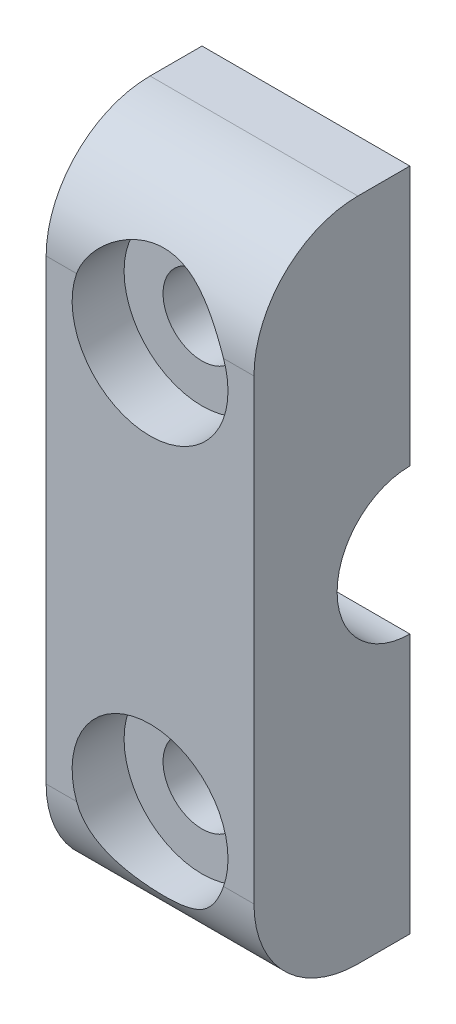
ISO-10303-21;
HEADER;
FILE_DESCRIPTION(('STEP AP214'),'2;1');
FILE_NAME('part.step','',(''),(''),'','','');
FILE_SCHEMA(('AUTOMOTIVE_DESIGN { 1 0 10303 214 1 1 1 1 }'));
ENDSEC;
DATA;
#1=APPLICATION_CONTEXT('core data for automotive mechanical design processes');
#2=APPLICATION_PROTOCOL_DEFINITION('international standard','automotive_design',2000,#1);
#3=PRODUCT_CONTEXT('',#1,'mechanical');
#4=PRODUCT('Part','Part','',(#3));
#5=PRODUCT_RELATED_PRODUCT_CATEGORY('part','',(#4));
#6=PRODUCT_DEFINITION_FORMATION('','',#4);
#7=PRODUCT_DEFINITION_CONTEXT('part definition',#1,'design');
#8=PRODUCT_DEFINITION('design','',#6,#7);
#9=PRODUCT_DEFINITION_SHAPE('','',#8);
#10=(LENGTH_UNIT() NAMED_UNIT(*) SI_UNIT(.MILLI.,.METRE.));
#11=(NAMED_UNIT(*) PLANE_ANGLE_UNIT() SI_UNIT($,.RADIAN.));
#12=(NAMED_UNIT(*) SI_UNIT($,.STERADIAN.) SOLID_ANGLE_UNIT());
#13=UNCERTAINTY_MEASURE_WITH_UNIT(LENGTH_MEASURE(1.E-05),#10,'distance_accuracy_value','');
#14=(GEOMETRIC_REPRESENTATION_CONTEXT(3) GLOBAL_UNCERTAINTY_ASSIGNED_CONTEXT((#13)) GLOBAL_UNIT_ASSIGNED_CONTEXT((#10,
#11,#12)) REPRESENTATION_CONTEXT('',''));
#15=CARTESIAN_POINT('',(0.,0.,0.));
#16=DIRECTION('',(0.,0.,1.));
#17=DIRECTION('',(1.,0.,0.));
#18=AXIS2_PLACEMENT_3D('',#15,#16,#17);
#19=CARTESIAN_POINT('',(0.,0.,0.));
#20=DIRECTION('',(0.,0.,1.));
#21=DIRECTION('',(1.,0.,0.));
#22=AXIS2_PLACEMENT_3D('',#19,#20,#21);
#23=PLANE('',#22);
#24=CARTESIAN_POINT('',(-128.440920983778,46.199185999186,0.));
#25=DIRECTION('',(0.,0.,1.));
#26=DIRECTION('',(1.,0.,0.));
#27=AXIS2_PLACEMENT_3D('',#24,#25,#26);
#28=CIRCLE('',#27,1.5);
#29=CARTESIAN_POINT('',(-126.940920983778,46.199185999186,0.));
#30=VERTEX_POINT('',#29);
#31=EDGE_CURVE('E246',#30,#30,#28,.T.);
#32=ORIENTED_EDGE('',*,*,#31,.T.);
#33=EDGE_LOOP('',(#32));
#34=FACE_BOUND('',#33,.T.);
#35=DIRECTION('',(0.,-1.,0.));
#36=VECTOR('',#35,1.);
#37=CARTESIAN_POINT('',(-132.440920983778,66.799185999186,0.));
#38=LINE('',#37,#36);
#39=CARTESIAN_POINT('',(-132.440920983778,51.199185999186,0.));
#40=VERTEX_POINT('',#39);
#41=CARTESIAN_POINT('',(-132.440920983778,41.199185999186,0.));
#42=VERTEX_POINT('',#41);
#43=EDGE_CURVE('E133',#40,#42,#38,.T.);
#44=ORIENTED_EDGE('',*,*,#43,.F.);
#45=DIRECTION('',(1.,0.,0.));
#46=VECTOR('',#45,1.);
#47=CARTESIAN_POINT('',(-132.440920983778,51.199185999186,0.));
#48=LINE('',#47,#46);
#49=CARTESIAN_POINT('',(-124.440920983778,51.199185999186,0.));
#50=VERTEX_POINT('',#49);
#51=EDGE_CURVE('E113',#40,#50,#48,.T.);
#52=ORIENTED_EDGE('',*,*,#51,.T.);
#53=DIRECTION('',(0.,1.,0.));
#54=VECTOR('',#53,1.);
#55=CARTESIAN_POINT('',(-124.440920983778,66.799185999186,0.));
#56=LINE('',#55,#54);
#57=CARTESIAN_POINT('',(-124.440920983778,41.199185999186,0.));
#58=VERTEX_POINT('',#57);
#59=EDGE_CURVE('E142',#58,#50,#56,.T.);
#60=ORIENTED_EDGE('',*,*,#59,.F.);
#61=DIRECTION('',(1.,0.,0.));
#62=VECTOR('',#61,1.);
#63=CARTESIAN_POINT('',(-132.440920983778,41.199185999186,0.));
#64=LINE('',#63,#62);
#65=EDGE_CURVE('E132',#42,#58,#64,.T.);
#66=ORIENTED_EDGE('',*,*,#65,.F.);
#67=EDGE_LOOP('',(#44,#52,#60,#66));
#68=FACE_BOUND('',#67,.T.);
#69=ADVANCED_FACE('F33',(#34,#68),#23,.F.);
#70=CARTESIAN_POINT('',(-128.440920983778,61.799185999186,6.));
#71=DIRECTION('',(0.,0.,-1.));
#72=DIRECTION('',(-1.,0.,0.));
#73=AXIS2_PLACEMENT_3D('',#70,#71,#72);
#74=CYLINDRICAL_SURFACE('',#73,1.5);
#75=CARTESIAN_POINT('',(-128.440920983778,61.799185999186,0.));
#76=DIRECTION('',(0.,0.,1.));
#77=DIRECTION('',(1.,0.,0.));
#78=AXIS2_PLACEMENT_3D('',#75,#76,#77);
#79=CIRCLE('',#78,1.5);
#80=CARTESIAN_POINT('',(-126.940920983778,61.799185999186,0.));
#81=VERTEX_POINT('',#80);
#82=EDGE_CURVE('E137',#81,#81,#79,.T.);
#83=ORIENTED_EDGE('',*,*,#82,.F.);
#84=EDGE_LOOP('',(#83));
#85=FACE_BOUND('',#84,.T.);
#86=CARTESIAN_POINT('',(-128.440920983778,61.799185999186,4.));
#87=DIRECTION('',(0.,0.,1.));
#88=DIRECTION('',(1.,0.,0.));
#89=AXIS2_PLACEMENT_3D('',#86,#87,#88);
#90=CIRCLE('',#89,1.5);
#91=CARTESIAN_POINT('',(-126.940920983778,61.799185999186,4.));
#92=VERTEX_POINT('',#91);
#93=EDGE_CURVE('E38',#92,#92,#90,.T.);
#94=ORIENTED_EDGE('',*,*,#93,.T.);
#95=EDGE_LOOP('',(#94));
#96=FACE_BOUND('',#95,.T.);
#97=ADVANCED_FACE('F208',(#85,#96),#74,.F.);
#98=CARTESIAN_POINT('',(-128.440920983778,46.199185999186,6.));
#99=DIRECTION('',(0.,0.,-1.));
#100=DIRECTION('',(-1.,0.,0.));
#101=AXIS2_PLACEMENT_3D('',#98,#99,#100);
#102=CYLINDRICAL_SURFACE('',#101,1.5);
#103=ORIENTED_EDGE('',*,*,#31,.F.);
#104=EDGE_LOOP('',(#103));
#105=FACE_BOUND('',#104,.T.);
#106=CARTESIAN_POINT('',(-128.440920983778,46.199185999186,4.));
#107=DIRECTION('',(0.,0.,1.));
#108=DIRECTION('',(1.,0.,0.));
#109=AXIS2_PLACEMENT_3D('',#106,#107,#108);
#110=CIRCLE('',#109,1.5);
#111=CARTESIAN_POINT('',(-126.940920983778,46.199185999186,4.));
#112=VERTEX_POINT('',#111);
#113=EDGE_CURVE('E276',#112,#112,#110,.T.);
#114=ORIENTED_EDGE('',*,*,#113,.T.);
#115=EDGE_LOOP('',(#114));
#116=FACE_BOUND('',#115,.T.);
#117=ADVANCED_FACE('F204',(#105,#116),#102,.F.);
#118=CARTESIAN_POINT('',(0.,0.,6.));
#119=DIRECTION('',(0.,0.,1.));
#120=DIRECTION('',(1.,0.,0.));
#121=AXIS2_PLACEMENT_3D('',#118,#119,#120);
#122=PLANE('',#121);
#123=CARTESIAN_POINT('',(-128.440920983778,46.199185999186,6.));
#124=DIRECTION('',(0.,0.,1.));
#125=DIRECTION('',(1.,0.,0.));
#126=AXIS2_PLACEMENT_3D('',#123,#124,#125);
#127=CIRCLE('',#126,2.99999999999999);
#128=CARTESIAN_POINT('',(-125.612493859032,45.199185999186,6.));
#129=VERTEX_POINT('',#128);
#130=CARTESIAN_POINT('',(-131.269348108524,45.199185999186,6.));
#131=VERTEX_POINT('',#130);
#132=EDGE_CURVE('E271',#129,#131,#127,.T.);
#133=ORIENTED_EDGE('',*,*,#132,.F.);
#134=DIRECTION('',(1.,0.,0.));
#135=VECTOR('',#134,1.);
#136=CARTESIAN_POINT('',(-124.440920983778,45.199185999186,6.));
#137=LINE('',#136,#135);
#138=CARTESIAN_POINT('',(-124.440920983778,45.199185999186,6.));
#139=VERTEX_POINT('',#138);
#140=EDGE_CURVE('E157',#129,#139,#137,.T.);
#141=ORIENTED_EDGE('',*,*,#140,.T.);
#142=DIRECTION('',(0.,1.,0.));
#143=VECTOR('',#142,1.);
#144=CARTESIAN_POINT('',(-124.440920983778,66.799185999186,6.));
#145=LINE('',#144,#143);
#146=CARTESIAN_POINT('',(-124.440920983778,62.799185999186,6.));
#147=VERTEX_POINT('',#146);
#148=EDGE_CURVE('E139',#139,#147,#145,.T.);
#149=ORIENTED_EDGE('',*,*,#148,.T.);
#150=DIRECTION('',(-1.,0.,0.));
#151=VECTOR('',#150,1.);
#152=CARTESIAN_POINT('',(-132.440920983778,62.799185999186,6.));
#153=LINE('',#152,#151);
#154=CARTESIAN_POINT('',(-125.612493859032,62.799185999186,6.));
#155=VERTEX_POINT('',#154);
#156=EDGE_CURVE('E164',#147,#155,#153,.T.);
#157=ORIENTED_EDGE('',*,*,#156,.T.);
#158=CARTESIAN_POINT('',(-128.440920983778,61.799185999186,6.));
#159=DIRECTION('',(0.,0.,1.));
#160=DIRECTION('',(1.,0.,0.));
#161=AXIS2_PLACEMENT_3D('',#158,#159,#160);
#162=CIRCLE('',#161,2.99999999999999);
#163=CARTESIAN_POINT('',(-131.269348108524,62.799185999186,6.));
#164=VERTEX_POINT('',#163);
#165=EDGE_CURVE('E57',#164,#155,#162,.T.);
#166=ORIENTED_EDGE('',*,*,#165,.F.);
#167=DIRECTION('',(-1.,0.,0.));
#168=VECTOR('',#167,1.);
#169=CARTESIAN_POINT('',(-132.440920983778,62.799185999186,6.));
#170=LINE('',#169,#168);
#171=CARTESIAN_POINT('',(-132.440920983778,62.799185999186,6.));
#172=VERTEX_POINT('',#171);
#173=EDGE_CURVE('E162',#164,#172,#170,.T.);
#174=ORIENTED_EDGE('',*,*,#173,.T.);
#175=DIRECTION('',(0.,-1.,0.));
#176=VECTOR('',#175,1.);
#177=CARTESIAN_POINT('',(-132.440920983778,66.799185999186,6.));
#178=LINE('',#177,#176);
#179=CARTESIAN_POINT('',(-132.440920983778,45.199185999186,6.));
#180=VERTEX_POINT('',#179);
#181=EDGE_CURVE('E147',#172,#180,#178,.T.);
#182=ORIENTED_EDGE('',*,*,#181,.T.);
#183=DIRECTION('',(1.,0.,0.));
#184=VECTOR('',#183,1.);
#185=CARTESIAN_POINT('',(-124.440920983778,45.199185999186,6.));
#186=LINE('',#185,#184);
#187=EDGE_CURVE('E159',#180,#131,#186,.T.);
#188=ORIENTED_EDGE('',*,*,#187,.T.);
#189=EDGE_LOOP('',(#133,#141,#149,#157,#166,#174,#182,#188));
#190=FACE_BOUND('',#189,.T.);
#191=ADVANCED_FACE('F207',(#190),#122,.T.);
#192=CARTESIAN_POINT('',(-124.440920983778,56.799185999186,0.));
#193=VERTEX_POINT('',#192);
#194=CARTESIAN_POINT('',(-124.440920983778,66.799185999186,0.));
#195=VERTEX_POINT('',#194);
#196=EDGE_CURVE('E126',#193,#195,#56,.T.);
#197=ORIENTED_EDGE('',*,*,#196,.F.);
#198=DIRECTION('',(1.,0.,0.));
#199=VECTOR('',#198,1.);
#200=CARTESIAN_POINT('',(-132.440920983778,56.799185999186,0.));
#201=LINE('',#200,#199);
#202=CARTESIAN_POINT('',(-132.440920983778,56.799185999186,0.));
#203=VERTEX_POINT('',#202);
#204=EDGE_CURVE('E51',#193,#203,#201,.F.);
#205=ORIENTED_EDGE('',*,*,#204,.T.);
#206=CARTESIAN_POINT('',(-132.440920983778,66.799185999186,0.));
#207=VERTEX_POINT('',#206);
#208=EDGE_CURVE('E125',#207,#203,#38,.T.);
#209=ORIENTED_EDGE('',*,*,#208,.F.);
#210=DIRECTION('',(-1.,0.,0.));
#211=VECTOR('',#210,1.);
#212=CARTESIAN_POINT('',(-132.440920983778,66.799185999186,0.));
#213=LINE('',#212,#211);
#214=EDGE_CURVE('E145',#195,#207,#213,.T.);
#215=ORIENTED_EDGE('',*,*,#214,.F.);
#216=EDGE_LOOP('',(#197,#205,#209,#215));
#217=FACE_BOUND('',#216,.T.);
#218=ORIENTED_EDGE('',*,*,#82,.T.);
#219=EDGE_LOOP('',(#218));
#220=FACE_BOUND('',#219,.T.);
#221=ADVANCED_FACE('F122',(#217,#220),#23,.F.);
#222=CARTESIAN_POINT('',(-132.440920983778,66.799185999186,6.));
#223=DIRECTION('',(1.,0.,0.));
#224=DIRECTION('',(0.,0.,-1.));
#225=AXIS2_PLACEMENT_3D('',#222,#223,#224);
#226=PLANE('',#225);
#227=ORIENTED_EDGE('',*,*,#208,.T.);
#228=CARTESIAN_POINT('',(-132.440920983778,53.999185999186,0.));
#229=DIRECTION('',(1.,0.,0.));
#230=DIRECTION('',(0.,0.,-1.));
#231=AXIS2_PLACEMENT_3D('',#228,#229,#230);
#232=CIRCLE('',#231,2.8);
#233=EDGE_CURVE('E110',#203,#40,#232,.T.);
#234=ORIENTED_EDGE('',*,*,#233,.T.);
#235=ORIENTED_EDGE('',*,*,#43,.T.);
#236=DIRECTION('',(0.,0.,-1.));
#237=VECTOR('',#236,1.);
#238=CARTESIAN_POINT('',(-132.440920983778,41.199185999186,6.));
#239=LINE('',#238,#237);
#240=CARTESIAN_POINT('',(-132.440920983778,41.199185999186,2.));
#241=VERTEX_POINT('',#240);
#242=EDGE_CURVE('E154',#241,#42,#239,.T.);
#243=ORIENTED_EDGE('',*,*,#242,.F.);
#244=CARTESIAN_POINT('',(-132.440920983778,45.199185999186,2.));
#245=DIRECTION('',(1.,0.,0.));
#246=DIRECTION('',(0.,0.,-1.));
#247=AXIS2_PLACEMENT_3D('',#244,#245,#246);
#248=CIRCLE('',#247,4.);
#249=EDGE_CURVE('E167',#241,#180,#248,.F.);
#250=ORIENTED_EDGE('',*,*,#249,.T.);
#251=ORIENTED_EDGE('',*,*,#181,.F.);
#252=CARTESIAN_POINT('',(-132.440920983778,62.799185999186,2.));
#253=DIRECTION('',(1.,0.,0.));
#254=DIRECTION('',(0.,0.,-1.));
#255=AXIS2_PLACEMENT_3D('',#252,#253,#254);
#256=CIRCLE('',#255,4.);
#257=CARTESIAN_POINT('',(-132.440920983778,66.799185999186,2.));
#258=VERTEX_POINT('',#257);
#259=EDGE_CURVE('E169',#172,#258,#256,.F.);
#260=ORIENTED_EDGE('',*,*,#259,.T.);
#261=DIRECTION('',(0.,0.,-1.));
#262=VECTOR('',#261,1.);
#263=CARTESIAN_POINT('',(-132.440920983778,66.799185999186,6.));
#264=LINE('',#263,#262);
#265=EDGE_CURVE('E130',#258,#207,#264,.T.);
#266=ORIENTED_EDGE('',*,*,#265,.T.);
#267=EDGE_LOOP('',(#227,#234,#235,#243,#250,#251,#260,#266));
#268=FACE_BOUND('',#267,.T.);
#269=ADVANCED_FACE('F128',(#268),#226,.F.);
#270=CARTESIAN_POINT('',(-132.440920983778,41.199185999186,6.));
#271=DIRECTION('',(0.,1.,0.));
#272=DIRECTION('',(0.,0.,1.));
#273=AXIS2_PLACEMENT_3D('',#270,#271,#272);
#274=PLANE('',#273);
#275=DIRECTION('',(0.,0.,-1.));
#276=VECTOR('',#275,1.);
#277=CARTESIAN_POINT('',(-124.440920983778,41.199185999186,6.));
#278=LINE('',#277,#276);
#279=CARTESIAN_POINT('',(-124.440920983778,41.199185999186,2.));
#280=VERTEX_POINT('',#279);
#281=EDGE_CURVE('E152',#280,#58,#278,.T.);
#282=ORIENTED_EDGE('',*,*,#281,.F.);
#283=DIRECTION('',(1.,0.,0.));
#284=VECTOR('',#283,1.);
#285=CARTESIAN_POINT('',(-132.440920983778,41.199185999186,2.));
#286=LINE('',#285,#284);
#287=EDGE_CURVE('E177',#280,#241,#286,.F.);
#288=ORIENTED_EDGE('',*,*,#287,.T.);
#289=ORIENTED_EDGE('',*,*,#242,.T.);
#290=ORIENTED_EDGE('',*,*,#65,.T.);
#291=EDGE_LOOP('',(#282,#288,#289,#290));
#292=FACE_BOUND('',#291,.T.);
#293=ADVANCED_FACE('F226',(#292),#274,.F.);
#294=CARTESIAN_POINT('',(-124.440920983778,66.799185999186,6.));
#295=DIRECTION('',(-1.,0.,0.));
#296=DIRECTION('',(0.,0.,1.));
#297=AXIS2_PLACEMENT_3D('',#294,#295,#296);
#298=PLANE('',#297);
#299=ORIENTED_EDGE('',*,*,#59,.T.);
#300=CARTESIAN_POINT('',(-124.440920983778,53.999185999186,0.));
#301=DIRECTION('',(1.,0.,0.));
#302=DIRECTION('',(0.,0.,-1.));
#303=AXIS2_PLACEMENT_3D('',#300,#301,#302);
#304=CIRCLE('',#303,2.8);
#305=EDGE_CURVE('E117',#193,#50,#304,.T.);
#306=ORIENTED_EDGE('',*,*,#305,.F.);
#307=ORIENTED_EDGE('',*,*,#196,.T.);
#308=DIRECTION('',(0.,0.,-1.));
#309=VECTOR('',#308,1.);
#310=CARTESIAN_POINT('',(-124.440920983778,66.799185999186,6.));
#311=LINE('',#310,#309);
#312=CARTESIAN_POINT('',(-124.440920983778,66.799185999186,2.));
#313=VERTEX_POINT('',#312);
#314=EDGE_CURVE('E149',#313,#195,#311,.T.);
#315=ORIENTED_EDGE('',*,*,#314,.F.);
#316=CARTESIAN_POINT('',(-124.440920983778,62.799185999186,2.));
#317=DIRECTION('',(-1.,0.,0.));
#318=DIRECTION('',(0.,0.,1.));
#319=AXIS2_PLACEMENT_3D('',#316,#317,#318);
#320=CIRCLE('',#319,4.);
#321=EDGE_CURVE('E175',#313,#147,#320,.F.);
#322=ORIENTED_EDGE('',*,*,#321,.T.);
#323=ORIENTED_EDGE('',*,*,#148,.F.);
#324=CARTESIAN_POINT('',(-124.440920983778,45.199185999186,2.));
#325=DIRECTION('',(-1.,0.,0.));
#326=DIRECTION('',(0.,0.,1.));
#327=AXIS2_PLACEMENT_3D('',#324,#325,#326);
#328=CIRCLE('',#327,4.);
#329=EDGE_CURVE('E173',#139,#280,#328,.F.);
#330=ORIENTED_EDGE('',*,*,#329,.T.);
#331=ORIENTED_EDGE('',*,*,#281,.T.);
#332=EDGE_LOOP('',(#299,#306,#307,#315,#322,#323,#330,#331));
#333=FACE_BOUND('',#332,.T.);
#334=ADVANCED_FACE('F222',(#333),#298,.F.);
#335=CARTESIAN_POINT('',(-132.440920983778,66.799185999186,6.));
#336=DIRECTION('',(0.,-1.,0.));
#337=DIRECTION('',(0.,0.,-1.));
#338=AXIS2_PLACEMENT_3D('',#335,#336,#337);
#339=PLANE('',#338);
#340=ORIENTED_EDGE('',*,*,#265,.F.);
#341=DIRECTION('',(-1.,0.,0.));
#342=VECTOR('',#341,1.);
#343=CARTESIAN_POINT('',(-124.440920983778,66.799185999186,2.));
#344=LINE('',#343,#342);
#345=EDGE_CURVE('E171',#258,#313,#344,.F.);
#346=ORIENTED_EDGE('',*,*,#345,.T.);
#347=ORIENTED_EDGE('',*,*,#314,.T.);
#348=ORIENTED_EDGE('',*,*,#214,.T.);
#349=EDGE_LOOP('',(#340,#346,#347,#348));
#350=FACE_BOUND('',#349,.T.);
#351=ADVANCED_FACE('F218',(#350),#339,.F.);
#352=CARTESIAN_POINT('',(0.,62.799185999186,2.));
#353=DIRECTION('',(1.,0.,0.));
#354=DIRECTION('',(0.,0.,-1.));
#355=AXIS2_PLACEMENT_3D('',#352,#353,#354);
#356=CYLINDRICAL_SURFACE('',#355,4.);
#357=CARTESIAN_POINT('',(-125.612493859032,62.799185999186,6.));
#358=CARTESIAN_POINT('',(-125.638959098005,62.8740849930859,6.00001363859899));
#359=CARTESIAN_POINT('',(-125.668416050436,62.9478943080878,5.99789689537595));
#360=CARTESIAN_POINT('',(-125.732962600044,63.0927147550407,5.98987040481588));
#361=CARTESIAN_POINT('',(-125.768046852475,63.1637284633007,5.98396424081535));
#362=CARTESIAN_POINT('',(-125.843315313248,63.3020540091859,5.96887167962501));
#363=CARTESIAN_POINT('',(-125.883466693367,63.3693859971517,5.95970576199665));
#364=CARTESIAN_POINT('',(-125.968680890268,63.5004037988799,5.93861664131602));
#365=CARTESIAN_POINT('',(-126.013744771964,63.5640888174835,5.92669283978885));
#366=CARTESIAN_POINT('',(-126.155457833037,63.7487082726402,5.88769322173158));
#367=CARTESIAN_POINT('',(-126.258952526413,63.8637980627325,5.85731619851917));
#368=CARTESIAN_POINT('',(-126.481755461474,64.0763488792784,5.79226485893223));
#369=CARTESIAN_POINT('',(-126.601096321181,64.1737725356028,5.75758168854185));
#370=CARTESIAN_POINT('',(-126.865362915688,64.3576892078563,5.68533860390704));
#371=CARTESIAN_POINT('',(-127.011642395713,64.4422621952459,5.64781871355356));
#372=CARTESIAN_POINT('',(-127.317716377316,64.5861033259084,5.57956977438406));
#373=CARTESIAN_POINT('',(-127.477501778727,64.6453883476811,5.54883620265602));
#374=CARTESIAN_POINT('',(-127.723540787131,64.7133862612227,5.51233144892342));
#375=CARTESIAN_POINT('',(-127.806316901338,64.732533451894,5.50178257446236));
#376=CARTESIAN_POINT('',(-127.973553718627,64.7637754027991,5.48435285686708));
#377=CARTESIAN_POINT('',(-128.058013537706,64.7758737680429,5.47747013889009));
#378=CARTESIAN_POINT('',(-128.227835661929,64.7928242370074,5.4677808571253));
#379=CARTESIAN_POINT('',(-128.313197312449,64.7976812759487,5.46497151722186));
#380=CARTESIAN_POINT('',(-128.484030660672,64.800094065229,5.46357615966924));
#381=CARTESIAN_POINT('',(-128.569502345556,64.7976506005523,5.46498968795745));
#382=CARTESIAN_POINT('',(-128.80338529356,64.7809291320593,5.47460872787473));
#383=CARTESIAN_POINT('',(-128.951164258718,64.7591799986303,5.48709577508512));
#384=CARTESIAN_POINT('',(-129.240574751354,64.6944605506181,5.52267628636299));
#385=CARTESIAN_POINT('',(-129.382203352378,64.6514802516636,5.54577474029424));
#386=CARTESIAN_POINT('',(-129.660836734992,64.5441450606779,5.59983728777502));
#387=CARTESIAN_POINT('',(-129.797549808051,64.4791519389959,5.63102883025544));
#388=CARTESIAN_POINT('',(-130.059230991009,64.3297612024909,5.6964827222045));
#389=CARTESIAN_POINT('',(-130.184187549942,64.2453447787584,5.73074802845647));
#390=CARTESIAN_POINT('',(-130.435715410277,64.0463505277244,5.80225773967939));
#391=CARTESIAN_POINT('',(-130.560380104657,63.929277092661,5.83930942976593));
#392=CARTESIAN_POINT('',(-130.788761044848,63.674496063844,5.90526069997846));
#393=CARTESIAN_POINT('',(-130.892522875954,63.5368345377156,5.93417807539512));
#394=CARTESIAN_POINT('',(-131.041889505452,63.2981355997949,5.96985859551223));
#395=CARTESIAN_POINT('',(-131.094840478954,63.2022765735625,5.98085856936742));
#396=CARTESIAN_POINT('',(-131.190236111296,63.004745624024,5.99595440671891));
#397=CARTESIAN_POINT('',(-131.232660880177,62.9030631362663,6.00003728344062));
#398=CARTESIAN_POINT('',(-131.269348108524,62.799185999186,6.));
#399=B_SPLINE_CURVE_WITH_KNOTS('',3,(#357,#358,#359,#360,#361,#362,#363,#364,#365,#366,#367,
#368,#369,#370,#371,#372,#373,#374,#375,#376,#377,#378,#379,#380,#381,#382,#383,#384,#385,#386,
#387,#388,#389,#390,#391,#392,#393,#394,#395,#396,#397,#398),.UNSPECIFIED.,.F.,.F.,(4,2,2,2,2,2,
2,2,2,2,2,2,2,2,2,2,2,2,2,2,4),(0.,0.238174503625694,0.476124116932519,0.712604468316778,
0.949136185373971,1.42019070956427,1.89223034348894,2.40915171876814,2.92572753197096,
3.1822476646937,3.43863648884375,3.69485049491544,3.95103695264521,4.39841330348801,
4.84600024240081,5.30786802280761,5.77018495783501,6.29267429339781,6.81401153772259,
7.14338886072961,7.47338390355225),.UNSPECIFIED.);
#400=EDGE_CURVE('E11',#155,#164,#399,.T.);
#401=ORIENTED_EDGE('',*,*,#400,.F.);
#402=ORIENTED_EDGE('',*,*,#156,.F.);
#403=ORIENTED_EDGE('',*,*,#321,.F.);
#404=ORIENTED_EDGE('',*,*,#345,.F.);
#405=ORIENTED_EDGE('',*,*,#259,.F.);
#406=ORIENTED_EDGE('',*,*,#173,.F.);
#407=EDGE_LOOP('',(#401,#402,#403,#404,#405,#406));
#408=FACE_BOUND('',#407,.T.);
#409=ADVANCED_FACE('F221',(#408),#356,.T.);
#410=CARTESIAN_POINT('',(0.,45.199185999186,2.));
#411=DIRECTION('',(-1.,0.,0.));
#412=DIRECTION('',(0.,0.,1.));
#413=AXIS2_PLACEMENT_3D('',#410,#411,#412);
#414=CYLINDRICAL_SURFACE('',#413,4.);
#415=CARTESIAN_POINT('',(-131.269348108524,45.199185999186,6.));
#416=CARTESIAN_POINT('',(-131.242882869551,45.1242870052861,6.00001363859899));
#417=CARTESIAN_POINT('',(-131.213425917121,45.0504776902842,5.99789689537595));
#418=CARTESIAN_POINT('',(-131.148879367513,44.9056572433312,5.98987040481588));
#419=CARTESIAN_POINT('',(-131.113795115082,44.8346435350713,5.98396424081535));
#420=CARTESIAN_POINT('',(-131.038526654309,44.6963179891861,5.96887167962501));
#421=CARTESIAN_POINT('',(-130.998375274189,44.6289860012202,5.95970576199665));
#422=CARTESIAN_POINT('',(-130.913161077288,44.497968199492,5.93861664131602));
#423=CARTESIAN_POINT('',(-130.868097195593,44.4342831808884,5.92669283978885));
#424=CARTESIAN_POINT('',(-130.726384134519,44.2496637257318,5.88769322173158));
#425=CARTESIAN_POINT('',(-130.622889441144,44.1345739356395,5.85731619851917));
#426=CARTESIAN_POINT('',(-130.400086506082,43.9220231190936,5.79226485893222));
#427=CARTESIAN_POINT('',(-130.280745646376,43.8245994627692,5.75758168854185));
#428=CARTESIAN_POINT('',(-130.016479051868,43.6406827905157,5.68533860390705));
#429=CARTESIAN_POINT('',(-129.870199571843,43.5561098031261,5.64781871355358));
#430=CARTESIAN_POINT('',(-129.56412559024,43.4122686724637,5.57956977438406));
#431=CARTESIAN_POINT('',(-129.404340188829,43.3529836506909,5.54883620265602));
#432=CARTESIAN_POINT('',(-129.158301180425,43.2849857371493,5.51233144892343));
#433=CARTESIAN_POINT('',(-129.075525066219,43.265838546478,5.50178257446237));
#434=CARTESIAN_POINT('',(-128.908288248929,43.2345965955728,5.48435285686709));
#435=CARTESIAN_POINT('',(-128.82382842985,43.2224982303291,5.47747013889009));
#436=CARTESIAN_POINT('',(-128.654006305627,43.2055477613646,5.4677808571253));
#437=CARTESIAN_POINT('',(-128.568644655107,43.2006907224233,5.46497151722186));
#438=CARTESIAN_POINT('',(-128.397811306884,43.198277933143,5.46357615966924));
#439=CARTESIAN_POINT('',(-128.312339622001,43.2007213978196,5.46498968795744));
#440=CARTESIAN_POINT('',(-128.078456673997,43.2174428663126,5.47460872787473));
#441=CARTESIAN_POINT('',(-127.930677708838,43.2391919997417,5.48709577508512));
#442=CARTESIAN_POINT('',(-127.641267216202,43.3039114477538,5.52267628636298));
#443=CARTESIAN_POINT('',(-127.499638615178,43.3468917467084,5.54577474029423));
#444=CARTESIAN_POINT('',(-127.221005232564,43.4542269376941,5.599837287775));
#445=CARTESIAN_POINT('',(-127.084292159506,43.5192200593761,5.63102883025543));
#446=CARTESIAN_POINT('',(-126.822610976547,43.668610795881,5.69648272220449));
#447=CARTESIAN_POINT('',(-126.697654417615,43.7530272196135,5.73074802845645));
#448=CARTESIAN_POINT('',(-126.446126557279,43.9520214706475,5.80225773967937));
#449=CARTESIAN_POINT('',(-126.3214618629,44.0690949057109,5.83930942976592));
#450=CARTESIAN_POINT('',(-126.093080922709,44.3238759345279,5.90526069997845));
#451=CARTESIAN_POINT('',(-125.989319091603,44.4615374606564,5.93417807539511));
#452=CARTESIAN_POINT('',(-125.839952462105,44.7002363985771,5.96985859551222));
#453=CARTESIAN_POINT('',(-125.787001488602,44.7960954248094,5.98085856936742));
#454=CARTESIAN_POINT('',(-125.69160585626,44.993626374348,5.99595440671891));
#455=CARTESIAN_POINT('',(-125.64918108738,45.0953088621057,6.00003728344062));
#456=CARTESIAN_POINT('',(-125.612493859032,45.199185999186,6.));
#457=B_SPLINE_CURVE_WITH_KNOTS('',3,(#415,#416,#417,#418,#419,#420,#421,#422,#423,#424,#425,
#426,#427,#428,#429,#430,#431,#432,#433,#434,#435,#436,#437,#438,#439,#440,#441,#442,#443,#444,
#445,#446,#447,#448,#449,#450,#451,#452,#453,#454,#455,#456),.UNSPECIFIED.,.F.,.F.,(4,2,2,2,2,2,
2,2,2,2,2,2,2,2,2,2,2,2,2,2,4),(0.,0.238174503625681,0.476124116932513,0.712604468316821,
0.949136185373942,1.4201907095643,1.8922303434889,2.40915171876808,2.92572753197093,
3.18224766469364,3.4386364888437,3.69485049491538,3.95103695264516,4.39841330348795,
4.84600024240075,5.30786802280757,5.77018495783494,6.29267429339777,6.81401153772254,
7.14338886072961,7.47338390355225),.UNSPECIFIED.);
#458=EDGE_CURVE('E43',#131,#129,#457,.T.);
#459=ORIENTED_EDGE('',*,*,#458,.F.);
#460=ORIENTED_EDGE('',*,*,#187,.F.);
#461=ORIENTED_EDGE('',*,*,#249,.F.);
#462=ORIENTED_EDGE('',*,*,#287,.F.);
#463=ORIENTED_EDGE('',*,*,#329,.F.);
#464=ORIENTED_EDGE('',*,*,#140,.F.);
#465=EDGE_LOOP('',(#459,#460,#461,#462,#463,#464));
#466=FACE_BOUND('',#465,.T.);
#467=ADVANCED_FACE('F35',(#466),#414,.T.);
#468=CARTESIAN_POINT('',(-128.440920983778,46.199185999186,4.));
#469=DIRECTION('',(0.,0.,1.));
#470=DIRECTION('',(1.,0.,0.));
#471=AXIS2_PLACEMENT_3D('',#468,#469,#470);
#472=CYLINDRICAL_SURFACE('',#471,2.99999999999999);
#473=ORIENTED_EDGE('',*,*,#458,.T.);
#474=ORIENTED_EDGE('',*,*,#132,.T.);
#475=EDGE_LOOP('',(#473,#474));
#476=FACE_BOUND('',#475,.T.);
#477=CARTESIAN_POINT('',(-128.440920983778,46.199185999186,4.));
#478=DIRECTION('',(0.,0.,1.));
#479=DIRECTION('',(1.,0.,0.));
#480=AXIS2_PLACEMENT_3D('',#477,#478,#479);
#481=CIRCLE('',#480,2.99999999999999);
#482=CARTESIAN_POINT('',(-125.440920983778,46.199185999186,4.));
#483=VERTEX_POINT('',#482);
#484=EDGE_CURVE('E273',#483,#483,#481,.T.);
#485=ORIENTED_EDGE('',*,*,#484,.F.);
#486=EDGE_LOOP('',(#485));
#487=FACE_BOUND('',#486,.T.);
#488=ADVANCED_FACE('F189',(#476,#487),#472,.F.);
#489=CARTESIAN_POINT('',(-128.440920983778,46.199185999186,4.));
#490=DIRECTION('',(0.,0.,1.));
#491=DIRECTION('',(1.,0.,0.));
#492=AXIS2_PLACEMENT_3D('',#489,#490,#491);
#493=PLANE('',#492);
#494=ORIENTED_EDGE('',*,*,#113,.F.);
#495=EDGE_LOOP('',(#494));
#496=FACE_BOUND('',#495,.T.);
#497=ORIENTED_EDGE('',*,*,#484,.T.);
#498=EDGE_LOOP('',(#497));
#499=FACE_BOUND('',#498,.T.);
#500=ADVANCED_FACE('F194',(#496,#499),#493,.T.);
#501=CARTESIAN_POINT('',(-128.440920983778,61.799185999186,4.));
#502=DIRECTION('',(0.,0.,1.));
#503=DIRECTION('',(1.,0.,0.));
#504=AXIS2_PLACEMENT_3D('',#501,#502,#503);
#505=CYLINDRICAL_SURFACE('',#504,2.99999999999999);
#506=ORIENTED_EDGE('',*,*,#400,.T.);
#507=ORIENTED_EDGE('',*,*,#165,.T.);
#508=EDGE_LOOP('',(#506,#507));
#509=FACE_BOUND('',#508,.T.);
#510=CARTESIAN_POINT('',(-128.440920983778,61.799185999186,4.));
#511=DIRECTION('',(0.,0.,1.));
#512=DIRECTION('',(1.,0.,0.));
#513=AXIS2_PLACEMENT_3D('',#510,#511,#512);
#514=CIRCLE('',#513,2.99999999999999);
#515=CARTESIAN_POINT('',(-125.440920983778,61.799185999186,4.));
#516=VERTEX_POINT('',#515);
#517=EDGE_CURVE('E268',#516,#516,#514,.T.);
#518=ORIENTED_EDGE('',*,*,#517,.F.);
#519=EDGE_LOOP('',(#518));
#520=FACE_BOUND('',#519,.T.);
#521=ADVANCED_FACE('F199',(#509,#520),#505,.F.);
#522=CARTESIAN_POINT('',(-128.440920983778,61.799185999186,4.));
#523=DIRECTION('',(0.,0.,1.));
#524=DIRECTION('',(1.,0.,0.));
#525=AXIS2_PLACEMENT_3D('',#522,#523,#524);
#526=PLANE('',#525);
#527=ORIENTED_EDGE('',*,*,#93,.F.);
#528=EDGE_LOOP('',(#527));
#529=FACE_BOUND('',#528,.T.);
#530=ORIENTED_EDGE('',*,*,#517,.T.);
#531=EDGE_LOOP('',(#530));
#532=FACE_BOUND('',#531,.T.);
#533=ADVANCED_FACE('F197',(#529,#532),#526,.T.);
#534=CARTESIAN_POINT('',(-132.440920983778,53.999185999186,0.));
#535=DIRECTION('',(1.,0.,0.));
#536=DIRECTION('',(0.,0.,-1.));
#537=AXIS2_PLACEMENT_3D('',#534,#535,#536);
#538=CYLINDRICAL_SURFACE('',#537,2.8);
#539=ORIENTED_EDGE('',*,*,#233,.F.);
#540=ORIENTED_EDGE('',*,*,#204,.F.);
#541=ORIENTED_EDGE('',*,*,#305,.T.);
#542=ORIENTED_EDGE('',*,*,#51,.F.);
#543=EDGE_LOOP('',(#539,#540,#541,#542));
#544=FACE_BOUND('',#543,.T.);
#545=ADVANCED_FACE('F111',(#544),#538,.F.);
#546=CLOSED_SHELL('',(#69,#97,#117,#191,#221,#269,#293,#334,#351,#409,#467,#488,#500,#521,#533,#545));
#547=MANIFOLD_SOLID_BREP('B2',#546);
#548=ADVANCED_BREP_SHAPE_REPRESENTATION('',(#18,#547),#14);
#549=SHAPE_DEFINITION_REPRESENTATION(#9,#548);
ENDSEC;
END-ISO-10303-21;
